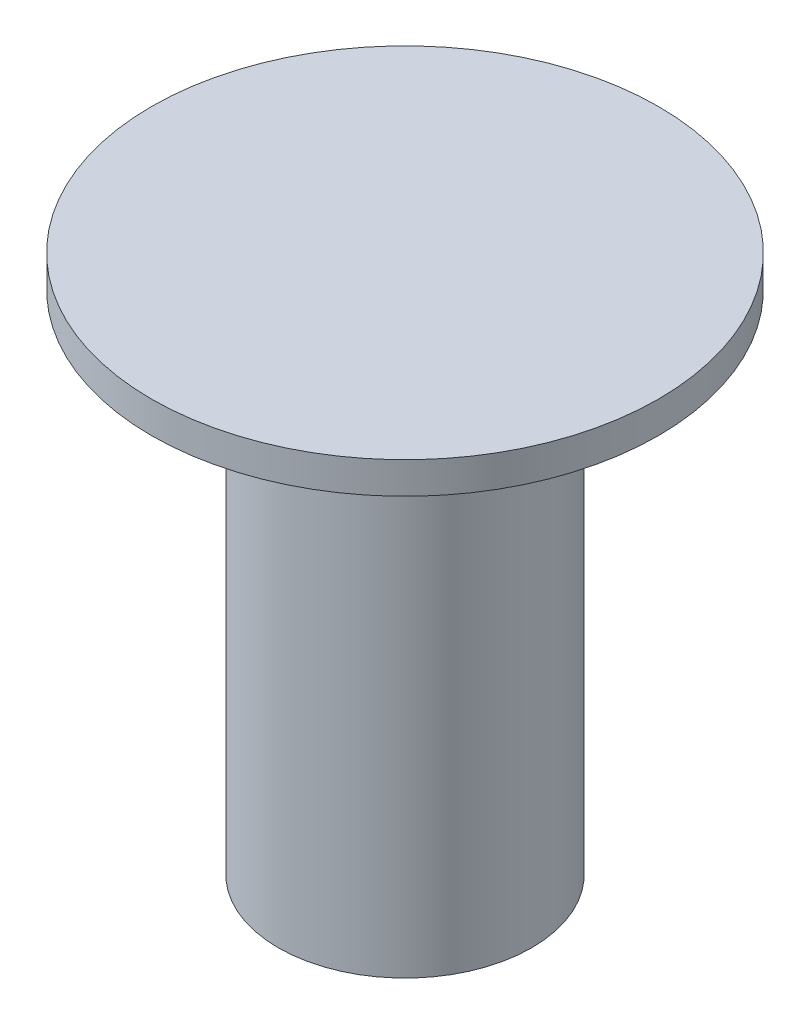
ISO-10303-21;
HEADER;
FILE_DESCRIPTION(('STEP AP214'),'2;1');
FILE_NAME('part.step','',(''),(''),'','','');
FILE_SCHEMA(('AUTOMOTIVE_DESIGN { 1 0 10303 214 1 1 1 1 }'));
ENDSEC;
DATA;
#1=APPLICATION_CONTEXT('core data for automotive mechanical design processes');
#2=APPLICATION_PROTOCOL_DEFINITION('international standard','automotive_design',2000,#1);
#3=PRODUCT_CONTEXT('',#1,'mechanical');
#4=PRODUCT('Part','Part','',(#3));
#5=PRODUCT_RELATED_PRODUCT_CATEGORY('part','',(#4));
#6=PRODUCT_DEFINITION_FORMATION('','',#4);
#7=PRODUCT_DEFINITION_CONTEXT('part definition',#1,'design');
#8=PRODUCT_DEFINITION('design','',#6,#7);
#9=PRODUCT_DEFINITION_SHAPE('','',#8);
#10=(LENGTH_UNIT() NAMED_UNIT(*) SI_UNIT(.MILLI.,.METRE.));
#11=(NAMED_UNIT(*) PLANE_ANGLE_UNIT() SI_UNIT($,.RADIAN.));
#12=(NAMED_UNIT(*) SI_UNIT($,.STERADIAN.) SOLID_ANGLE_UNIT());
#13=UNCERTAINTY_MEASURE_WITH_UNIT(LENGTH_MEASURE(1.E-05),#10,'distance_accuracy_value','');
#14=(GEOMETRIC_REPRESENTATION_CONTEXT(3) GLOBAL_UNCERTAINTY_ASSIGNED_CONTEXT((#13)) GLOBAL_UNIT_ASSIGNED_CONTEXT((#10,
#11,#12)) REPRESENTATION_CONTEXT('',''));
#15=CARTESIAN_POINT('',(0.,0.,0.));
#16=DIRECTION('',(0.,0.,1.));
#17=DIRECTION('',(1.,0.,0.));
#18=AXIS2_PLACEMENT_3D('',#15,#16,#17);
#19=CARTESIAN_POINT('',(0.,32.,0.));
#20=DIRECTION('',(0.,-1.,0.));
#21=DIRECTION('',(0.,0.,-1.));
#22=AXIS2_PLACEMENT_3D('',#19,#20,#21);
#23=CYLINDRICAL_SURFACE('',#22,8.);
#24=CARTESIAN_POINT('',(0.,32.,0.));
#25=DIRECTION('',(0.,1.,0.));
#26=DIRECTION('',(0.,0.,1.));
#27=AXIS2_PLACEMENT_3D('',#24,#25,#26);
#28=CIRCLE('',#27,8.);
#29=CARTESIAN_POINT('',(0.,32.,8.));
#30=VERTEX_POINT('',#29);
#31=EDGE_CURVE('E10',#30,#30,#28,.T.);
#32=ORIENTED_EDGE('',*,*,#31,.F.);
#33=EDGE_LOOP('',(#32));
#34=FACE_BOUND('',#33,.T.);
#35=CARTESIAN_POINT('',(0.,0.,0.));
#36=DIRECTION('',(0.,1.,0.));
#37=DIRECTION('',(0.,0.,1.));
#38=AXIS2_PLACEMENT_3D('',#35,#36,#37);
#39=CIRCLE('',#38,8.);
#40=CARTESIAN_POINT('',(0.,0.,8.));
#41=VERTEX_POINT('',#40);
#42=EDGE_CURVE('E46',#41,#41,#39,.T.);
#43=ORIENTED_EDGE('',*,*,#42,.T.);
#44=EDGE_LOOP('',(#43));
#45=FACE_BOUND('',#44,.T.);
#46=ADVANCED_FACE('F43',(#34,#45),#23,.T.);
#47=CARTESIAN_POINT('',(0.,0.,0.));
#48=DIRECTION('',(0.,1.,0.));
#49=DIRECTION('',(0.,0.,1.));
#50=AXIS2_PLACEMENT_3D('',#47,#48,#49);
#51=PLANE('',#50);
#52=ORIENTED_EDGE('',*,*,#42,.F.);
#53=EDGE_LOOP('',(#52));
#54=FACE_BOUND('',#53,.T.);
#55=ADVANCED_FACE('F69',(#54),#51,.F.);
#56=CARTESIAN_POINT('',(0.,34.,0.));
#57=DIRECTION('',(0.,-1.,0.));
#58=DIRECTION('',(0.,0.,-1.));
#59=AXIS2_PLACEMENT_3D('',#56,#57,#58);
#60=CYLINDRICAL_SURFACE('',#59,16.);
#61=CARTESIAN_POINT('',(0.,34.,0.));
#62=DIRECTION('',(0.,1.,0.));
#63=DIRECTION('',(0.,0.,1.));
#64=AXIS2_PLACEMENT_3D('',#61,#62,#63);
#65=CIRCLE('',#64,16.);
#66=CARTESIAN_POINT('',(0.,34.,16.));
#67=VERTEX_POINT('',#66);
#68=EDGE_CURVE('E54',#67,#67,#65,.T.);
#69=ORIENTED_EDGE('',*,*,#68,.F.);
#70=EDGE_LOOP('',(#69));
#71=FACE_BOUND('',#70,.T.);
#72=CARTESIAN_POINT('',(0.,32.,0.));
#73=DIRECTION('',(0.,1.,0.));
#74=DIRECTION('',(0.,0.,1.));
#75=AXIS2_PLACEMENT_3D('',#72,#73,#74);
#76=CIRCLE('',#75,16.);
#77=CARTESIAN_POINT('',(0.,32.,16.));
#78=VERTEX_POINT('',#77);
#79=EDGE_CURVE('E60',#78,#78,#76,.T.);
#80=ORIENTED_EDGE('',*,*,#79,.T.);
#81=EDGE_LOOP('',(#80));
#82=FACE_BOUND('',#81,.T.);
#83=ADVANCED_FACE('F70',(#71,#82),#60,.T.);
#84=CARTESIAN_POINT('',(0.,34.,0.));
#85=DIRECTION('',(0.,1.,0.));
#86=DIRECTION('',(0.,0.,1.));
#87=AXIS2_PLACEMENT_3D('',#84,#85,#86);
#88=PLANE('',#87);
#89=ORIENTED_EDGE('',*,*,#68,.T.);
#90=EDGE_LOOP('',(#89));
#91=FACE_BOUND('',#90,.T.);
#92=ADVANCED_FACE('F61',(#91),#88,.T.);
#93=CARTESIAN_POINT('',(0.,32.,0.));
#94=DIRECTION('',(0.,1.,0.));
#95=DIRECTION('',(0.,0.,1.));
#96=AXIS2_PLACEMENT_3D('',#93,#94,#95);
#97=PLANE('',#96);
#98=ORIENTED_EDGE('',*,*,#31,.T.);
#99=EDGE_LOOP('',(#98));
#100=FACE_BOUND('',#99,.T.);
#101=ORIENTED_EDGE('',*,*,#79,.F.);
#102=EDGE_LOOP('',(#101));
#103=FACE_BOUND('',#102,.T.);
#104=ADVANCED_FACE('F74',(#100,#103),#97,.F.);
#105=CLOSED_SHELL('',(#46,#55,#83,#92,#104));
#106=MANIFOLD_SOLID_BREP('B2',#105);
#107=ADVANCED_BREP_SHAPE_REPRESENTATION('',(#18,#106),#14);
#108=SHAPE_DEFINITION_REPRESENTATION(#9,#107);
ENDSEC;
END-ISO-10303-21;
